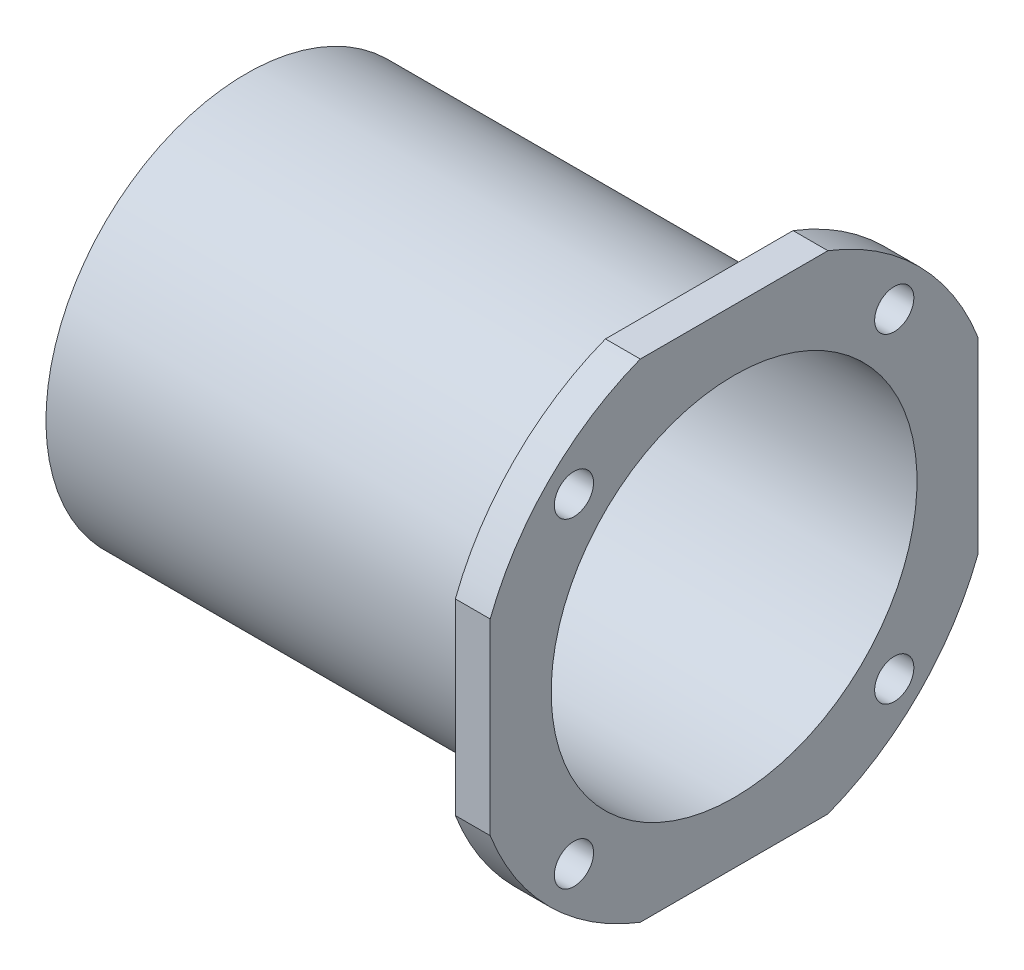
ISO-10303-21;
HEADER;
FILE_DESCRIPTION(('STEP AP214'),'2;1');
FILE_NAME('part.step','',(''),(''),'','','');
FILE_SCHEMA(('AUTOMOTIVE_DESIGN { 1 0 10303 214 1 1 1 1 }'));
ENDSEC;
DATA;
#1=APPLICATION_CONTEXT('core data for automotive mechanical design processes');
#2=APPLICATION_PROTOCOL_DEFINITION('international standard','automotive_design',2000,#1);
#3=PRODUCT_CONTEXT('',#1,'mechanical');
#4=PRODUCT('Part','Part','',(#3));
#5=PRODUCT_RELATED_PRODUCT_CATEGORY('part','',(#4));
#6=PRODUCT_DEFINITION_FORMATION('','',#4);
#7=PRODUCT_DEFINITION_CONTEXT('part definition',#1,'design');
#8=PRODUCT_DEFINITION('design','',#6,#7);
#9=PRODUCT_DEFINITION_SHAPE('','',#8);
#10=(LENGTH_UNIT() NAMED_UNIT(*) SI_UNIT(.MILLI.,.METRE.));
#11=(NAMED_UNIT(*) PLANE_ANGLE_UNIT() SI_UNIT($,.RADIAN.));
#12=(NAMED_UNIT(*) SI_UNIT($,.STERADIAN.) SOLID_ANGLE_UNIT());
#13=UNCERTAINTY_MEASURE_WITH_UNIT(LENGTH_MEASURE(1.E-05),#10,'distance_accuracy_value','');
#14=(GEOMETRIC_REPRESENTATION_CONTEXT(3) GLOBAL_UNCERTAINTY_ASSIGNED_CONTEXT((#13)) GLOBAL_UNIT_ASSIGNED_CONTEXT((#10,
#11,#12)) REPRESENTATION_CONTEXT('',''));
#15=CARTESIAN_POINT('',(0.,0.,0.));
#16=DIRECTION('',(0.,0.,1.));
#17=DIRECTION('',(1.,0.,0.));
#18=AXIS2_PLACEMENT_3D('',#15,#16,#17);
#19=CARTESIAN_POINT('',(56.,21.,0.));
#20=DIRECTION('',(-1.,0.,0.));
#21=DIRECTION('',(0.,-1.,0.));
#22=AXIS2_PLACEMENT_3D('',#19,#20,#21);
#23=PLANE('',#22);
#24=CARTESIAN_POINT('',(56.,-18.3847763108503,-18.3847763108507));
#25=DIRECTION('',(1.,0.,0.));
#26=DIRECTION('',(0.,0.,-1.));
#27=AXIS2_PLACEMENT_3D('',#24,#25,#26);
#28=CIRCLE('',#27,2.25);
#29=CARTESIAN_POINT('',(56.,-18.3847763108503,-20.6347763108507));
#30=VERTEX_POINT('',#29);
#31=EDGE_CURVE('E594',#30,#30,#28,.T.);
#32=ORIENTED_EDGE('',*,*,#31,.F.);
#33=EDGE_LOOP('',(#32));
#34=FACE_BOUND('',#33,.T.);
#35=CARTESIAN_POINT('',(56.,18.3847763108497,18.3847763108502));
#36=DIRECTION('',(1.,0.,0.));
#37=DIRECTION('',(0.,0.,-1.));
#38=AXIS2_PLACEMENT_3D('',#35,#36,#37);
#39=CIRCLE('',#38,2.25);
#40=CARTESIAN_POINT('',(56.,18.3847763108497,16.1347763108502));
#41=VERTEX_POINT('',#40);
#42=EDGE_CURVE('E608',#41,#41,#39,.T.);
#43=ORIENTED_EDGE('',*,*,#42,.F.);
#44=EDGE_LOOP('',(#43));
#45=FACE_BOUND('',#44,.T.);
#46=CARTESIAN_POINT('',(56.,0.,0.));
#47=DIRECTION('',(-1.,0.,0.));
#48=DIRECTION('',(0.,-1.,0.));
#49=AXIS2_PLACEMENT_3D('',#46,#47,#48);
#50=CIRCLE('',#49,21.);
#51=CARTESIAN_POINT('',(56.,-21.,0.));
#52=VERTEX_POINT('',#51);
#53=EDGE_CURVE('E178',#52,#52,#50,.T.);
#54=ORIENTED_EDGE('',*,*,#53,.T.);
#55=EDGE_LOOP('',(#54));
#56=FACE_BOUND('',#55,.T.);
#57=DIRECTION('',(0.,0.,1.));
#58=VECTOR('',#57,1.);
#59=CARTESIAN_POINT('',(56.,28.,28.));
#60=LINE('',#59,#58);
#61=CARTESIAN_POINT('',(56.,28.,-10.770329614269));
#62=VERTEX_POINT('',#61);
#63=CARTESIAN_POINT('',(56.,28.,10.770329614269));
#64=VERTEX_POINT('',#63);
#65=EDGE_CURVE('E616',#62,#64,#60,.T.);
#66=ORIENTED_EDGE('',*,*,#65,.T.);
#67=CARTESIAN_POINT('',(56.,0.,0.));
#68=DIRECTION('',(-1.,0.,0.));
#69=DIRECTION('',(0.,-1.,0.));
#70=AXIS2_PLACEMENT_3D('',#67,#68,#69);
#71=CIRCLE('',#70,30.);
#72=CARTESIAN_POINT('',(56.,10.770329614269,28.));
#73=VERTEX_POINT('',#72);
#74=EDGE_CURVE('E179',#73,#64,#71,.T.);
#75=ORIENTED_EDGE('',*,*,#74,.F.);
#76=DIRECTION('',(0.,-1.,0.));
#77=VECTOR('',#76,1.);
#78=CARTESIAN_POINT('',(56.,-28.,28.));
#79=LINE('',#78,#77);
#80=CARTESIAN_POINT('',(56.,-10.770329614269,28.));
#81=VERTEX_POINT('',#80);
#82=EDGE_CURVE('E619',#73,#81,#79,.T.);
#83=ORIENTED_EDGE('',*,*,#82,.T.);
#84=CARTESIAN_POINT('',(56.,-28.,10.770329614269));
#85=VERTEX_POINT('',#84);
#86=EDGE_CURVE('E175',#85,#81,#71,.T.);
#87=ORIENTED_EDGE('',*,*,#86,.F.);
#88=DIRECTION('',(0.,0.,-1.));
#89=VECTOR('',#88,1.);
#90=CARTESIAN_POINT('',(56.,-28.,28.));
#91=LINE('',#90,#89);
#92=CARTESIAN_POINT('',(56.,-28.,-10.770329614269));
#93=VERTEX_POINT('',#92);
#94=EDGE_CURVE('E161',#85,#93,#91,.T.);
#95=ORIENTED_EDGE('',*,*,#94,.T.);
#96=CARTESIAN_POINT('',(56.,-10.770329614269,-28.));
#97=VERTEX_POINT('',#96);
#98=EDGE_CURVE('E173',#97,#93,#71,.T.);
#99=ORIENTED_EDGE('',*,*,#98,.F.);
#100=DIRECTION('',(0.,1.,0.));
#101=VECTOR('',#100,1.);
#102=CARTESIAN_POINT('',(56.,-28.,-28.));
#103=LINE('',#102,#101);
#104=CARTESIAN_POINT('',(56.,10.770329614269,-28.));
#105=VERTEX_POINT('',#104);
#106=EDGE_CURVE('E614',#97,#105,#103,.T.);
#107=ORIENTED_EDGE('',*,*,#106,.T.);
#108=EDGE_CURVE('E160',#62,#105,#71,.T.);
#109=ORIENTED_EDGE('',*,*,#108,.F.);
#110=EDGE_LOOP('',(#66,#75,#83,#87,#95,#99,#107,#109));
#111=FACE_BOUND('',#110,.T.);
#112=CARTESIAN_POINT('',(56.,-18.3847763108507,18.3847763108497));
#113=DIRECTION('',(1.,0.,0.));
#114=DIRECTION('',(0.,0.,-1.));
#115=AXIS2_PLACEMENT_3D('',#112,#113,#114);
#116=CIRCLE('',#115,2.25);
#117=CARTESIAN_POINT('',(56.,-18.3847763108507,16.1347763108497));
#118=VERTEX_POINT('',#117);
#119=EDGE_CURVE('E602',#118,#118,#116,.T.);
#120=ORIENTED_EDGE('',*,*,#119,.F.);
#121=EDGE_LOOP('',(#120));
#122=FACE_BOUND('',#121,.T.);
#123=CARTESIAN_POINT('',(56.,18.3847763108502,-18.3847763108503));
#124=DIRECTION('',(1.,0.,0.));
#125=DIRECTION('',(0.,0.,-1.));
#126=AXIS2_PLACEMENT_3D('',#123,#124,#125);
#127=CIRCLE('',#126,2.25);
#128=CARTESIAN_POINT('',(56.,18.3847763108502,-20.6347763108503));
#129=VERTEX_POINT('',#128);
#130=EDGE_CURVE('E591',#129,#129,#127,.T.);
#131=ORIENTED_EDGE('',*,*,#130,.F.);
#132=EDGE_LOOP('',(#131));
#133=FACE_BOUND('',#132,.T.);
#134=ADVANCED_FACE('F33',(#34,#45,#56,#111,#122,#133),#23,.F.);
#135=CARTESIAN_POINT('',(0.,0.,0.));
#136=DIRECTION('',(-1.,0.,0.));
#137=DIRECTION('',(0.,-1.,0.));
#138=AXIS2_PLACEMENT_3D('',#135,#136,#137);
#139=CYLINDRICAL_SURFACE('',#138,30.);
#140=DIRECTION('',(-1.,0.,0.));
#141=VECTOR('',#140,1.);
#142=CARTESIAN_POINT('',(0.,28.,-10.770329614269));
#143=LINE('',#142,#141);
#144=CARTESIAN_POINT('',(52.,28.,-10.770329614269));
#145=VERTEX_POINT('',#144);
#146=EDGE_CURVE('E55',#62,#145,#143,.T.);
#147=ORIENTED_EDGE('',*,*,#146,.F.);
#148=ORIENTED_EDGE('',*,*,#108,.T.);
#149=DIRECTION('',(-1.,0.,0.));
#150=VECTOR('',#149,1.);
#151=CARTESIAN_POINT('',(0.,10.770329614269,-28.));
#152=LINE('',#151,#150);
#153=CARTESIAN_POINT('',(52.,10.770329614269,-28.));
#154=VERTEX_POINT('',#153);
#155=EDGE_CURVE('E145',#154,#105,#152,.F.);
#156=ORIENTED_EDGE('',*,*,#155,.F.);
#157=CARTESIAN_POINT('',(52.,0.,0.));
#158=DIRECTION('',(-1.,0.,0.));
#159=DIRECTION('',(0.,-1.,0.));
#160=AXIS2_PLACEMENT_3D('',#157,#158,#159);
#161=CIRCLE('',#160,30.);
#162=EDGE_CURVE('E158',#145,#154,#161,.T.);
#163=ORIENTED_EDGE('',*,*,#162,.F.);
#164=EDGE_LOOP('',(#147,#148,#156,#163));
#165=FACE_BOUND('',#164,.T.);
#166=ADVANCED_FACE('F157',(#165),#139,.T.);
#167=DIRECTION('',(-1.,0.,0.));
#168=VECTOR('',#167,1.);
#169=CARTESIAN_POINT('',(0.,28.,10.770329614269));
#170=LINE('',#169,#168);
#171=CARTESIAN_POINT('',(52.,28.,10.770329614269));
#172=VERTEX_POINT('',#171);
#173=EDGE_CURVE('E633',#172,#64,#170,.F.);
#174=ORIENTED_EDGE('',*,*,#173,.F.);
#175=CARTESIAN_POINT('',(52.,10.770329614269,28.));
#176=VERTEX_POINT('',#175);
#177=EDGE_CURVE('E165',#176,#172,#161,.T.);
#178=ORIENTED_EDGE('',*,*,#177,.F.);
#179=DIRECTION('',(-1.,0.,0.));
#180=VECTOR('',#179,1.);
#181=CARTESIAN_POINT('',(0.,10.770329614269,28.));
#182=LINE('',#181,#180);
#183=EDGE_CURVE('E631',#73,#176,#182,.T.);
#184=ORIENTED_EDGE('',*,*,#183,.F.);
#185=ORIENTED_EDGE('',*,*,#74,.T.);
#186=EDGE_LOOP('',(#174,#178,#184,#185));
#187=FACE_BOUND('',#186,.T.);
#188=ADVANCED_FACE('F228',(#187),#139,.T.);
#189=DIRECTION('',(-1.,0.,0.));
#190=VECTOR('',#189,1.);
#191=CARTESIAN_POINT('',(0.,-10.770329614269,28.));
#192=LINE('',#191,#190);
#193=CARTESIAN_POINT('',(52.,-10.770329614269,28.));
#194=VERTEX_POINT('',#193);
#195=EDGE_CURVE('E629',#194,#81,#192,.F.);
#196=ORIENTED_EDGE('',*,*,#195,.F.);
#197=CARTESIAN_POINT('',(52.,-28.,10.770329614269));
#198=VERTEX_POINT('',#197);
#199=EDGE_CURVE('E168',#198,#194,#161,.T.);
#200=ORIENTED_EDGE('',*,*,#199,.F.);
#201=DIRECTION('',(-1.,0.,0.));
#202=VECTOR('',#201,1.);
#203=CARTESIAN_POINT('',(0.,-28.,10.770329614269));
#204=LINE('',#203,#202);
#205=EDGE_CURVE('E627',#85,#198,#204,.T.);
#206=ORIENTED_EDGE('',*,*,#205,.F.);
#207=ORIENTED_EDGE('',*,*,#86,.T.);
#208=EDGE_LOOP('',(#196,#200,#206,#207));
#209=FACE_BOUND('',#208,.T.);
#210=ADVANCED_FACE('F479',(#209),#139,.T.);
#211=DIRECTION('',(-1.,0.,0.));
#212=VECTOR('',#211,1.);
#213=CARTESIAN_POINT('',(0.,-28.,-10.770329614269));
#214=LINE('',#213,#212);
#215=CARTESIAN_POINT('',(52.,-28.,-10.770329614269));
#216=VERTEX_POINT('',#215);
#217=EDGE_CURVE('E625',#216,#93,#214,.F.);
#218=ORIENTED_EDGE('',*,*,#217,.F.);
#219=CARTESIAN_POINT('',(52.,-10.770329614269,-28.));
#220=VERTEX_POINT('',#219);
#221=EDGE_CURVE('E166',#220,#216,#161,.T.);
#222=ORIENTED_EDGE('',*,*,#221,.F.);
#223=DIRECTION('',(-1.,0.,0.));
#224=VECTOR('',#223,1.);
#225=CARTESIAN_POINT('',(0.,-10.770329614269,-28.));
#226=LINE('',#225,#224);
#227=EDGE_CURVE('E48',#97,#220,#226,.T.);
#228=ORIENTED_EDGE('',*,*,#227,.F.);
#229=ORIENTED_EDGE('',*,*,#98,.T.);
#230=EDGE_LOOP('',(#218,#222,#228,#229));
#231=FACE_BOUND('',#230,.T.);
#232=ADVANCED_FACE('F224',(#231),#139,.T.);
#233=CARTESIAN_POINT('',(52.,23.,0.));
#234=DIRECTION('',(1.,0.,0.));
#235=DIRECTION('',(0.,1.,0.));
#236=AXIS2_PLACEMENT_3D('',#233,#234,#235);
#237=PLANE('',#236);
#238=CARTESIAN_POINT('',(52.,18.3847763108502,-18.3847763108503));
#239=DIRECTION('',(1.,0.,0.));
#240=DIRECTION('',(0.,1.,0.));
#241=AXIS2_PLACEMENT_3D('',#238,#239,#240);
#242=CIRCLE('',#241,2.25);
#243=CARTESIAN_POINT('',(52.,20.6347763108502,-18.3847763108503));
#244=VERTEX_POINT('',#243);
#245=EDGE_CURVE('E588',#244,#244,#242,.T.);
#246=ORIENTED_EDGE('',*,*,#245,.T.);
#247=EDGE_LOOP('',(#246));
#248=FACE_BOUND('',#247,.T.);
#249=CARTESIAN_POINT('',(52.,-18.3847763108503,-18.3847763108507));
#250=DIRECTION('',(1.,0.,0.));
#251=DIRECTION('',(0.,1.,0.));
#252=AXIS2_PLACEMENT_3D('',#249,#250,#251);
#253=CIRCLE('',#252,2.25);
#254=CARTESIAN_POINT('',(52.,-16.1347763108503,-18.3847763108507));
#255=VERTEX_POINT('',#254);
#256=EDGE_CURVE('E599',#255,#255,#253,.T.);
#257=ORIENTED_EDGE('',*,*,#256,.T.);
#258=EDGE_LOOP('',(#257));
#259=FACE_BOUND('',#258,.T.);
#260=CARTESIAN_POINT('',(52.,-18.3847763108507,18.3847763108497));
#261=DIRECTION('',(1.,0.,0.));
#262=DIRECTION('',(0.,1.,0.));
#263=AXIS2_PLACEMENT_3D('',#260,#261,#262);
#264=CIRCLE('',#263,2.25);
#265=CARTESIAN_POINT('',(52.,-16.1347763108507,18.3847763108497));
#266=VERTEX_POINT('',#265);
#267=EDGE_CURVE('E605',#266,#266,#264,.T.);
#268=ORIENTED_EDGE('',*,*,#267,.T.);
#269=EDGE_LOOP('',(#268));
#270=FACE_BOUND('',#269,.T.);
#271=CARTESIAN_POINT('',(52.,18.3847763108497,18.3847763108502));
#272=DIRECTION('',(1.,0.,0.));
#273=DIRECTION('',(0.,1.,0.));
#274=AXIS2_PLACEMENT_3D('',#271,#272,#273);
#275=CIRCLE('',#274,2.25);
#276=CARTESIAN_POINT('',(52.,20.6347763108497,18.3847763108502));
#277=VERTEX_POINT('',#276);
#278=EDGE_CURVE('E611',#277,#277,#275,.T.);
#279=ORIENTED_EDGE('',*,*,#278,.T.);
#280=EDGE_LOOP('',(#279));
#281=FACE_BOUND('',#280,.T.);
#282=CARTESIAN_POINT('',(52.,0.,0.));
#283=DIRECTION('',(-1.,0.,0.));
#284=DIRECTION('',(0.,-1.,0.));
#285=AXIS2_PLACEMENT_3D('',#282,#283,#284);
#286=CIRCLE('',#285,23.);
#287=CARTESIAN_POINT('',(52.,-23.,0.));
#288=VERTEX_POINT('',#287);
#289=EDGE_CURVE('E169',#288,#288,#286,.T.);
#290=ORIENTED_EDGE('',*,*,#289,.F.);
#291=EDGE_LOOP('',(#290));
#292=FACE_BOUND('',#291,.T.);
#293=DIRECTION('',(0.,0.,1.));
#294=VECTOR('',#293,1.);
#295=CARTESIAN_POINT('',(52.,28.,0.));
#296=LINE('',#295,#294);
#297=EDGE_CURVE('E12',#145,#172,#296,.T.);
#298=ORIENTED_EDGE('',*,*,#297,.F.);
#299=ORIENTED_EDGE('',*,*,#162,.T.);
#300=DIRECTION('',(0.,1.,0.));
#301=VECTOR('',#300,1.);
#302=CARTESIAN_POINT('',(52.,23.,-28.));
#303=LINE('',#302,#301);
#304=EDGE_CURVE('E142',#220,#154,#303,.T.);
#305=ORIENTED_EDGE('',*,*,#304,.F.);
#306=ORIENTED_EDGE('',*,*,#221,.T.);
#307=DIRECTION('',(0.,0.,-1.));
#308=VECTOR('',#307,1.);
#309=CARTESIAN_POINT('',(52.,-28.,0.));
#310=LINE('',#309,#308);
#311=EDGE_CURVE('E151',#198,#216,#310,.T.);
#312=ORIENTED_EDGE('',*,*,#311,.F.);
#313=ORIENTED_EDGE('',*,*,#199,.T.);
#314=DIRECTION('',(0.,-1.,0.));
#315=VECTOR('',#314,1.);
#316=CARTESIAN_POINT('',(52.,23.,28.));
#317=LINE('',#316,#315);
#318=EDGE_CURVE('E41',#176,#194,#317,.T.);
#319=ORIENTED_EDGE('',*,*,#318,.F.);
#320=ORIENTED_EDGE('',*,*,#177,.T.);
#321=EDGE_LOOP('',(#298,#299,#305,#306,#312,#313,#319,#320));
#322=FACE_BOUND('',#321,.T.);
#323=ADVANCED_FACE('F163',(#248,#259,#270,#281,#292,#322),#237,.F.);
#324=CARTESIAN_POINT('',(0.,0.,0.));
#325=DIRECTION('',(-1.,0.,0.));
#326=DIRECTION('',(0.,-1.,0.));
#327=AXIS2_PLACEMENT_3D('',#324,#325,#326);
#328=CYLINDRICAL_SURFACE('',#327,23.);
#329=CARTESIAN_POINT('',(0.,0.,0.));
#330=DIRECTION('',(-1.,0.,0.));
#331=DIRECTION('',(0.,-1.,0.));
#332=AXIS2_PLACEMENT_3D('',#329,#330,#331);
#333=CIRCLE('',#332,23.);
#334=CARTESIAN_POINT('',(0.,-23.,0.));
#335=VERTEX_POINT('',#334);
#336=EDGE_CURVE('E192',#335,#335,#333,.T.);
#337=ORIENTED_EDGE('',*,*,#336,.F.);
#338=EDGE_LOOP('',(#337));
#339=FACE_BOUND('',#338,.T.);
#340=ORIENTED_EDGE('',*,*,#289,.T.);
#341=EDGE_LOOP('',(#340));
#342=FACE_BOUND('',#341,.T.);
#343=ADVANCED_FACE('F35',(#339,#342),#328,.T.);
#344=CARTESIAN_POINT('',(0.,14.,0.));
#345=DIRECTION('',(1.,0.,0.));
#346=DIRECTION('',(0.,1.,0.));
#347=AXIS2_PLACEMENT_3D('',#344,#345,#346);
#348=PLANE('',#347);
#349=CARTESIAN_POINT('',(0.,0.,0.));
#350=DIRECTION('',(-1.,0.,0.));
#351=DIRECTION('',(0.,-1.,0.));
#352=AXIS2_PLACEMENT_3D('',#349,#350,#351);
#353=CIRCLE('',#352,14.);
#354=CARTESIAN_POINT('',(0.,2.22715383484865,13.8217142857143));
#355=VERTEX_POINT('',#354);
#356=CARTESIAN_POINT('',(0.,13.8217142857143,2.22715383484878));
#357=VERTEX_POINT('',#356);
#358=EDGE_CURVE('E188',#355,#357,#353,.T.);
#359=ORIENTED_EDGE('',*,*,#358,.F.);
#360=CARTESIAN_POINT('',(0.,2.46546825617527E-13,17.5000000000002));
#361=DIRECTION('',(-1.,0.,0.));
#362=DIRECTION('',(0.,0.,1.));
#363=AXIS2_PLACEMENT_3D('',#360,#361,#362);
#364=CIRCLE('',#363,4.3);
#365=CARTESIAN_POINT('',(0.,-2.22715383484826,13.8217142857144));
#366=VERTEX_POINT('',#365);
#367=EDGE_CURVE('E636',#366,#355,#364,.T.);
#368=ORIENTED_EDGE('',*,*,#367,.F.);
#369=CARTESIAN_POINT('',(0.,-13.8217142857142,2.22715383484917));
#370=VERTEX_POINT('',#369);
#371=EDGE_CURVE('E332',#370,#366,#353,.T.);
#372=ORIENTED_EDGE('',*,*,#371,.F.);
#373=CARTESIAN_POINT('',(0.,-17.5,4.93093651235054E-13));
#374=DIRECTION('',(-1.,0.,0.));
#375=DIRECTION('',(0.,0.,1.));
#376=AXIS2_PLACEMENT_3D('',#373,#374,#375);
#377=CIRCLE('',#376,4.3);
#378=CARTESIAN_POINT('',(0.,-13.8217142857144,-2.22715383484839));
#379=VERTEX_POINT('',#378);
#380=EDGE_CURVE('E325',#379,#370,#377,.T.);
#381=ORIENTED_EDGE('',*,*,#380,.F.);
#382=CARTESIAN_POINT('',(0.,-2.2271538348493,-13.8217142857142));
#383=VERTEX_POINT('',#382);
#384=EDGE_CURVE('E193',#383,#379,#353,.T.);
#385=ORIENTED_EDGE('',*,*,#384,.F.);
#386=CARTESIAN_POINT('',(0.,-2.44403693719019E-13,-17.4999999999998));
#387=DIRECTION('',(-1.,0.,0.));
#388=DIRECTION('',(0.,0.,1.));
#389=AXIS2_PLACEMENT_3D('',#386,#387,#388);
#390=CIRCLE('',#389,4.3);
#391=CARTESIAN_POINT('',(0.,2.22715383484891,-13.8217142857143));
#392=VERTEX_POINT('',#391);
#393=EDGE_CURVE('E343',#392,#383,#390,.T.);
#394=ORIENTED_EDGE('',*,*,#393,.F.);
#395=CARTESIAN_POINT('',(0.,13.8217142857143,-2.22715383484877));
#396=VERTEX_POINT('',#395);
#397=EDGE_CURVE('E189',#396,#392,#353,.T.);
#398=ORIENTED_EDGE('',*,*,#397,.F.);
#399=CARTESIAN_POINT('',(0.,17.5,0.));
#400=DIRECTION('',(-1.,0.,0.));
#401=DIRECTION('',(0.,0.,1.));
#402=AXIS2_PLACEMENT_3D('',#399,#400,#401);
#403=CIRCLE('',#402,4.3);
#404=EDGE_CURVE('E350',#357,#396,#403,.T.);
#405=ORIENTED_EDGE('',*,*,#404,.F.);
#406=EDGE_LOOP('',(#359,#368,#372,#381,#385,#394,#398,#405));
#407=FACE_BOUND('',#406,.T.);
#408=ORIENTED_EDGE('',*,*,#336,.T.);
#409=EDGE_LOOP('',(#408));
#410=FACE_BOUND('',#409,.T.);
#411=ADVANCED_FACE('F241',(#407,#410),#348,.F.);
#412=CARTESIAN_POINT('',(0.,0.,0.));
#413=DIRECTION('',(-1.,0.,0.));
#414=DIRECTION('',(0.,-1.,0.));
#415=AXIS2_PLACEMENT_3D('',#412,#413,#414);
#416=CYLINDRICAL_SURFACE('',#415,14.);
#417=CARTESIAN_POINT('',(5.,0.,0.));
#418=DIRECTION('',(-1.,0.,0.));
#419=DIRECTION('',(0.,-1.,0.));
#420=AXIS2_PLACEMENT_3D('',#417,#418,#419);
#421=CIRCLE('',#420,14.);
#422=CARTESIAN_POINT('',(5.,-14.,0.));
#423=VERTEX_POINT('',#422);
#424=EDGE_CURVE('E185',#423,#423,#421,.T.);
#425=ORIENTED_EDGE('',*,*,#424,.F.);
#426=EDGE_LOOP('',(#425));
#427=FACE_BOUND('',#426,.T.);
#428=CARTESIAN_POINT('',(0.499799999999979,-2.22745880103719,13.8216651417144));
#429=CARTESIAN_POINT('',(0.53452700887366,-2.17450267195264,13.8301988409129));
#430=CARTESIAN_POINT('',(0.568682868682122,-2.12113362184093,13.8384879815731));
#431=CARTESIAN_POINT('',(0.635686060217597,-2.01348576873813,13.8545602886711));
#432=CARTESIAN_POINT('',(0.66853303272463,-1.95920672172952,13.8623433165732));
#433=CARTESIAN_POINT('',(0.765113427459077,-1.79444409633226,13.8849668023181));
#434=CARTESIAN_POINT('',(0.826579881423483,-1.68249632642874,13.8990067709712));
#435=CARTESIAN_POINT('',(0.942752297210117,-1.45191250125192,13.9250024136205));
#436=CARTESIAN_POINT('',(0.997291302715078,-1.33318581836001,13.9369087329985));
#437=CARTESIAN_POINT('',(1.09533691874521,-1.09115905950565,13.957939394927));
#438=CARTESIAN_POINT('',(1.13886387644188,-0.967867908025646,13.967068874707));
#439=CARTESIAN_POINT('',(1.19851266990156,-0.762931476370153,13.9794236389379));
#440=CARTESIAN_POINT('',(1.2188338557511,-0.682561875823442,13.9835868705551));
#441=CARTESIAN_POINT('',(1.25307436531957,-0.520386819043669,13.9905603807477));
#442=CARTESIAN_POINT('',(1.26699346034359,-0.438581311625625,13.9933706109915));
#443=CARTESIAN_POINT('',(1.28770321184612,-0.274831076276759,13.9975394032496));
#444=CARTESIAN_POINT('',(1.29456155427785,-0.192895358087667,13.9989117514227));
#445=CARTESIAN_POINT('',(1.30105433815106,-0.0287273210950633,14.0002111524851));
#446=CARTESIAN_POINT('',(1.30068916852169,0.0535049815013604,14.000138283188));
#447=CARTESIAN_POINT('',(1.29275109237279,0.217607134094813,13.9985491542739));
#448=CARTESIAN_POINT('',(1.28517799968419,0.299476974675159,13.9970328573755));
#449=CARTESIAN_POINT('',(1.26319837700686,0.462237666722742,13.9926043465482));
#450=CARTESIAN_POINT('',(1.24879125662505,0.543128432988259,13.9896920120151));
#451=CARTESIAN_POINT('',(1.19589114820037,0.785113096770269,13.9789044903566));
#452=CARTESIAN_POINT('',(1.14780631961457,0.944071029493465,13.9689947124549));
#453=CARTESIAN_POINT('',(1.05270811004604,1.20015087805847,13.9488342648143));
#454=CARTESIAN_POINT('',(1.01114627245461,1.29953956583062,13.939902594349));
#455=CARTESIAN_POINT('',(0.921517045156459,1.49525723898225,13.9202680942927));
#456=CARTESIAN_POINT('',(0.873444873510951,1.5915839104395,13.9095639615021));
#457=CARTESIAN_POINT('',(0.773200023767398,1.77935250765614,13.8867809536507));
#458=CARTESIAN_POINT('',(0.721129599429609,1.8708537685084,13.8747341587205));
#459=CARTESIAN_POINT('',(0.613134639840423,2.05109927537818,13.8492317295261));
#460=CARTESIAN_POINT('',(0.557218288070547,2.13984882602937,13.8357790568541));
#461=CARTESIAN_POINT('',(0.4998,2.22745880103755,13.8216651417143));
#462=B_SPLINE_CURVE_WITH_KNOTS('',3,(#428,#429,#430,#431,#432,#433,#434,#435,#436,#437,#438,
#439,#440,#441,#442,#443,#444,#445,#446,#447,#448,#449,#450,#451,#452,#453,#454,#455,#456,#457,
#458,#459,#460,#461),.UNSPECIFIED.,.F.,.F.,(4,2,2,2,2,2,2,2,2,2,2,2,2,2,2,2,4),(0.,
0.191689711953611,0.38343167521143,0.768589902940532,1.16174888862297,1.55417603224027,
1.80295482789625,2.05174250971579,2.29812240118419,2.54448902707517,2.79086201639302,
3.03725629380239,3.53434488194304,3.85842911793776,4.18275270299694,4.50053525074866,
4.81766136649005),.UNSPECIFIED.);
#463=CARTESIAN_POINT('',(0.5,-2.22715383484826,13.8217142857144));
#464=VERTEX_POINT('',#463);
#465=CARTESIAN_POINT('',(0.499999999999999,2.22715383484865,13.8217142857143));
#466=VERTEX_POINT('',#465);
#467=EDGE_CURVE('E266',#464,#466,#462,.T.);
#468=ORIENTED_EDGE('',*,*,#467,.T.);
#469=DIRECTION('',(-1.,0.,0.));
#470=VECTOR('',#469,1.);
#471=CARTESIAN_POINT('',(0.249999999999999,2.22715383484865,13.8217142857143));
#472=LINE('',#471,#470);
#473=EDGE_CURVE('E152',#466,#355,#472,.T.);
#474=ORIENTED_EDGE('',*,*,#473,.T.);
#475=ORIENTED_EDGE('',*,*,#358,.T.);
#476=DIRECTION('',(-1.,0.,0.));
#477=VECTOR('',#476,1.);
#478=CARTESIAN_POINT('',(0.249999999999999,13.8217142857143,2.22715383484878));
#479=LINE('',#478,#477);
#480=CARTESIAN_POINT('',(0.5,13.8217142857143,2.22715383484878));
#481=VERTEX_POINT('',#480);
#482=EDGE_CURVE('E204',#357,#481,#479,.F.);
#483=ORIENTED_EDGE('',*,*,#482,.T.);
#484=CARTESIAN_POINT('',(0.4998,13.8216651417143,2.22745880103767));
#485=CARTESIAN_POINT('',(0.534527008873686,13.8301988409129,2.17450267195312));
#486=CARTESIAN_POINT('',(0.568682868682154,13.8384879815731,2.12113362184141));
#487=CARTESIAN_POINT('',(0.635686060217638,13.854560288671,2.01348576873861));
#488=CARTESIAN_POINT('',(0.668533032724677,13.8623433165731,1.95920672172999));
#489=CARTESIAN_POINT('',(0.765113427459139,13.884966802318,1.79444409633273));
#490=CARTESIAN_POINT('',(0.826579881423556,13.8990067709712,1.68249632642922));
#491=CARTESIAN_POINT('',(0.942752297210214,13.9250024136204,1.45191250125239));
#492=CARTESIAN_POINT('',(0.997291302715187,13.9369087329985,1.33318581836048));
#493=CARTESIAN_POINT('',(1.09533691874535,13.957939394927,1.09115905950611));
#494=CARTESIAN_POINT('',(1.13886387644203,13.967068874707,0.967867908026103));
#495=CARTESIAN_POINT('',(1.19851266990173,13.9794236389379,0.762931476370609));
#496=CARTESIAN_POINT('',(1.21883385575127,13.9835868705551,0.682561875823902));
#497=CARTESIAN_POINT('',(1.25307436531976,13.9905603807477,0.520386819044138));
#498=CARTESIAN_POINT('',(1.26699346034379,13.9933706109915,0.438581311626097));
#499=CARTESIAN_POINT('',(1.28770321184634,13.9975394032496,0.274831076277239));
#500=CARTESIAN_POINT('',(1.29456155427807,13.9989117514227,0.192895358088149));
#501=CARTESIAN_POINT('',(1.3010543381513,14.0002111524851,0.0287273210955515));
#502=CARTESIAN_POINT('',(1.30068916852194,14.000138283188,-0.0535049815008695));
#503=CARTESIAN_POINT('',(1.29275109237306,13.9985491542739,-0.217607134094318));
#504=CARTESIAN_POINT('',(1.28517799968447,13.9970328573755,-0.299476974674663));
#505=CARTESIAN_POINT('',(1.26319837700715,13.9926043465483,-0.462237666722245));
#506=CARTESIAN_POINT('',(1.24879125662535,13.9896920120151,-0.543128432987761));
#507=CARTESIAN_POINT('',(1.19589114820069,13.9789044903567,-0.78511309676977));
#508=CARTESIAN_POINT('',(1.1478063196149,13.9689947124549,-0.944071029492966));
#509=CARTESIAN_POINT('',(1.05270811004637,13.9488342648143,-1.20015087805804));
#510=CARTESIAN_POINT('',(1.01114627245492,13.9399025943491,-1.29953956583024));
#511=CARTESIAN_POINT('',(0.921517045156714,13.9202680942927,-1.495257238982));
#512=CARTESIAN_POINT('',(0.873444873511176,13.9095639615021,-1.5915839104393));
#513=CARTESIAN_POINT('',(0.773200023767559,13.8867809536507,-1.77935250765605));
#514=CARTESIAN_POINT('',(0.721129599429737,13.8747341587205,-1.87085376850837));
#515=CARTESIAN_POINT('',(0.61313463984048,13.8492317295261,-2.05109927537824));
#516=CARTESIAN_POINT('',(0.557218288070565,13.8357790568541,-2.13984882602948));
#517=CARTESIAN_POINT('',(0.499799999999978,13.8216651417143,-2.22745880103771));
#518=B_SPLINE_CURVE_WITH_KNOTS('',3,(#484,#485,#486,#487,#488,#489,#490,#491,#492,#493,#494,
#495,#496,#497,#498,#499,#500,#501,#502,#503,#504,#505,#506,#507,#508,#509,#510,#511,#512,#513,
#514,#515,#516,#517),.UNSPECIFIED.,.F.,.F.,(4,2,2,2,2,2,2,2,2,2,2,2,2,2,2,2,4),(0.,
0.191689711953621,0.383431675211451,0.768589902940572,1.16174888862303,1.55417603224036,
1.80295482789633,2.05174250971587,2.29812240118426,2.54448902707523,2.79086201639308,
3.03725629380244,3.53434488194308,3.858429117938,4.18275270299737,4.50053525074927,
4.81766136649085),.UNSPECIFIED.);
#519=CARTESIAN_POINT('',(0.499999999999998,13.8217142857143,-2.22715383484878));
#520=VERTEX_POINT('',#519);
#521=EDGE_CURVE('E196',#481,#520,#518,.T.);
#522=ORIENTED_EDGE('',*,*,#521,.T.);
#523=DIRECTION('',(-1.,0.,0.));
#524=VECTOR('',#523,1.);
#525=CARTESIAN_POINT('',(0.249999999999999,13.8217142857143,-2.22715383484878));
#526=LINE('',#525,#524);
#527=EDGE_CURVE('E359',#520,#396,#526,.T.);
#528=ORIENTED_EDGE('',*,*,#527,.T.);
#529=ORIENTED_EDGE('',*,*,#397,.T.);
#530=DIRECTION('',(-1.,0.,0.));
#531=VECTOR('',#530,1.);
#532=CARTESIAN_POINT('',(0.249999999999999,2.22715383484891,-13.8217142857143));
#533=LINE('',#532,#531);
#534=CARTESIAN_POINT('',(0.5,2.22715383484891,-13.8217142857143));
#535=VERTEX_POINT('',#534);
#536=EDGE_CURVE('E367',#392,#535,#533,.F.);
#537=ORIENTED_EDGE('',*,*,#536,.T.);
#538=CARTESIAN_POINT('',(0.4998,2.2274588010378,-13.8216651417143));
#539=CARTESIAN_POINT('',(0.534527008873691,2.17450267195325,-13.8301988409128));
#540=CARTESIAN_POINT('',(0.568682868682164,2.12113362184154,-13.838487981573));
#541=CARTESIAN_POINT('',(0.63568606021766,2.01348576873874,-13.854560288671));
#542=CARTESIAN_POINT('',(0.668533032724705,1.95920672173012,-13.8623433165731));
#543=CARTESIAN_POINT('',(0.765113427459184,1.79444409633286,-13.884966802318));
#544=CARTESIAN_POINT('',(0.826579881423613,1.68249632642934,-13.8990067709712));
#545=CARTESIAN_POINT('',(0.942752297210297,1.4519125012525,-13.9250024136204));
#546=CARTESIAN_POINT('',(0.997291302715285,1.33318581836059,-13.9369087329985));
#547=CARTESIAN_POINT('',(1.09533691874548,1.09115905950621,-13.957939394927));
#548=CARTESIAN_POINT('',(1.13886387644217,0.967867908026199,-13.9670688747069));
#549=CARTESIAN_POINT('',(1.1985126699019,0.762931476370705,-13.9794236389379));
#550=CARTESIAN_POINT('',(1.21883385575145,0.682561875824002,-13.9835868705551));
#551=CARTESIAN_POINT('',(1.25307436531995,0.520386819044247,-13.9905603807477));
#552=CARTESIAN_POINT('',(1.26699346034399,0.43858131162621,-13.9933706109914));
#553=CARTESIAN_POINT('',(1.28770321184655,0.27483107627736,-13.9975394032496));
#554=CARTESIAN_POINT('',(1.2945615542783,0.192895358088275,-13.9989117514227));
#555=CARTESIAN_POINT('',(1.30105433815155,0.0287273210956834,-14.0002111524851));
#556=CARTESIAN_POINT('',(1.3006891685222,-0.0535049815007348,-14.000138283188));
#557=CARTESIAN_POINT('',(1.29275109237333,-0.217607134094179,-13.9985491542739));
#558=CARTESIAN_POINT('',(1.28517799968475,-0.299476974674522,-13.9970328573755));
#559=CARTESIAN_POINT('',(1.26319837700746,-0.462237666722102,-13.9926043465483));
#560=CARTESIAN_POINT('',(1.24879125662566,-0.543128432987617,-13.9896920120151));
#561=CARTESIAN_POINT('',(1.19589114820103,-0.785113096769625,-13.9789044903567));
#562=CARTESIAN_POINT('',(1.14780631961525,-0.944071029492822,-13.9689947124549));
#563=CARTESIAN_POINT('',(1.05270811004672,-1.20015087805796,-13.9488342648143));
#564=CARTESIAN_POINT('',(1.01114627245524,-1.29953956583022,-13.9399025943491));
#565=CARTESIAN_POINT('',(0.921517045156989,-1.4952572389821,-13.9202680942927));
#566=CARTESIAN_POINT('',(0.873444873511422,-1.59158391043946,-13.9095639615021));
#567=CARTESIAN_POINT('',(0.773200023767742,-1.77935250765632,-13.8867809536507));
#568=CARTESIAN_POINT('',(0.721129599429886,-1.87085376850869,-13.8747341587205));
#569=CARTESIAN_POINT('',(0.613134639840556,-2.05109927537867,-13.8492317295261));
#570=CARTESIAN_POINT('',(0.557218288070603,-2.13984882602995,-13.835779056854));
#571=CARTESIAN_POINT('',(0.499799999999978,-2.22745880103822,-13.8216651417142));
#572=B_SPLINE_CURVE_WITH_KNOTS('',3,(#538,#539,#540,#541,#542,#543,#544,#545,#546,#547,#548,
#549,#550,#551,#552,#553,#554,#555,#556,#557,#558,#559,#560,#561,#562,#563,#564,#565,#566,#567,
#568,#569,#570,#571),.UNSPECIFIED.,.F.,.F.,(4,2,2,2,2,2,2,2,2,2,2,2,2,2,2,2,4),(0.,
0.191689711953633,0.383431675211474,0.768589902940619,1.16174888862311,1.55417603224047,
1.80295482789643,2.05174250971596,2.29812240118434,2.54448902707531,2.79086201639314,
3.0372562938025,3.53434488194313,3.85842911793824,4.1827527029978,4.5005352507499,
4.81766136649166),.UNSPECIFIED.);
#573=CARTESIAN_POINT('',(0.499999999999998,-2.22715383484929,-13.8217142857142));
#574=VERTEX_POINT('',#573);
#575=EDGE_CURVE('E360',#535,#574,#572,.T.);
#576=ORIENTED_EDGE('',*,*,#575,.T.);
#577=DIRECTION('',(-1.,0.,0.));
#578=VECTOR('',#577,1.);
#579=CARTESIAN_POINT('',(0.249999999999999,-2.2271538348493,-13.8217142857142));
#580=LINE('',#579,#578);
#581=EDGE_CURVE('E316',#574,#383,#580,.T.);
#582=ORIENTED_EDGE('',*,*,#581,.T.);
#583=ORIENTED_EDGE('',*,*,#384,.T.);
#584=DIRECTION('',(-1.,0.,0.));
#585=VECTOR('',#584,1.);
#586=CARTESIAN_POINT('',(0.249999999999999,-13.8217142857144,-2.22715383484839));
#587=LINE('',#586,#585);
#588=CARTESIAN_POINT('',(0.5,-13.8217142857144,-2.22715383484839));
#589=VERTEX_POINT('',#588);
#590=EDGE_CURVE('E277',#379,#589,#587,.F.);
#591=ORIENTED_EDGE('',*,*,#590,.T.);
#592=CARTESIAN_POINT('',(0.499799999999978,-13.8216651417143,-2.22745880103732));
#593=CARTESIAN_POINT('',(0.534527008873664,-13.8301988409129,-2.17450267195277));
#594=CARTESIAN_POINT('',(0.568682868682132,-13.8384879815731,-2.12113362184106));
#595=CARTESIAN_POINT('',(0.635686060217618,-13.8545602886711,-2.01348576873826));
#596=CARTESIAN_POINT('',(0.668533032724658,-13.8623433165731,-1.95920672172964));
#597=CARTESIAN_POINT('',(0.765113427459122,-13.8849668023181,-1.79444409633238));
#598=CARTESIAN_POINT('',(0.826579881423541,-13.8990067709712,-1.68249632642886));
#599=CARTESIAN_POINT('',(0.942752297210201,-13.9250024136205,-1.45191250125203));
#600=CARTESIAN_POINT('',(0.997291302715175,-13.9369087329985,-1.33318581836012));
#601=CARTESIAN_POINT('',(1.09533691874534,-13.957939394927,-1.09115905950574));
#602=CARTESIAN_POINT('',(1.13886387644202,-13.967068874707,-0.967867908025738));
#603=CARTESIAN_POINT('',(1.19851266990172,-13.9794236389379,-0.762931476370243));
#604=CARTESIAN_POINT('',(1.21883385575127,-13.9835868705551,-0.682561875823536));
#605=CARTESIAN_POINT('',(1.25307436531976,-13.9905603807477,-0.520386819043772));
#606=CARTESIAN_POINT('',(1.26699346034379,-13.9933706109915,-0.438581311625731));
#607=CARTESIAN_POINT('',(1.28770321184634,-13.9975394032496,-0.274831076276873));
#608=CARTESIAN_POINT('',(1.29456155427807,-13.9989117514227,-0.192895358087784));
#609=CARTESIAN_POINT('',(1.30105433815131,-14.0002111524851,-0.0287273210951867));
#610=CARTESIAN_POINT('',(1.30068916852194,-14.000138283188,0.0535049815012342));
#611=CARTESIAN_POINT('',(1.29275109237307,-13.9985491542739,0.217607134094683));
#612=CARTESIAN_POINT('',(1.28517799968447,-13.9970328573755,0.299476974675027));
#613=CARTESIAN_POINT('',(1.26319837700716,-13.9926043465482,0.462237666722609));
#614=CARTESIAN_POINT('',(1.24879125662536,-13.9896920120151,0.543128432988125));
#615=CARTESIAN_POINT('',(1.1958911482007,-13.9789044903566,0.785113096770135));
#616=CARTESIAN_POINT('',(1.14780631961491,-13.9689947124549,0.944071029493331));
#617=CARTESIAN_POINT('',(1.05270811004638,-13.9488342648143,1.2001508780584));
#618=CARTESIAN_POINT('',(1.01114627245493,-13.939902594349,1.29953956583061));
#619=CARTESIAN_POINT('',(0.92151704515673,-13.9202680942927,1.49525723898236));
#620=CARTESIAN_POINT('',(0.873444873511193,-13.9095639615021,1.59158391043966));
#621=CARTESIAN_POINT('',(0.773200023767577,-13.8867809536507,1.77935250765642));
#622=CARTESIAN_POINT('',(0.721129599429755,-13.8747341587205,1.87085376850873));
#623=CARTESIAN_POINT('',(0.613134639840498,-13.8492317295261,2.0510992753786));
#624=CARTESIAN_POINT('',(0.557218288070584,-13.8357790568541,2.13984882602984));
#625=CARTESIAN_POINT('',(0.499799999999999,-13.8216651417142,2.22745880103807));
#626=B_SPLINE_CURVE_WITH_KNOTS('',3,(#592,#593,#594,#595,#596,#597,#598,#599,#600,#601,#602,
#603,#604,#605,#606,#607,#608,#609,#610,#611,#612,#613,#614,#615,#616,#617,#618,#619,#620,#621,
#622,#623,#624,#625),.UNSPECIFIED.,.F.,.F.,(4,2,2,2,2,2,2,2,2,2,2,2,2,2,2,2,4),(0.,
0.191689711953623,0.383431675211454,0.768589902940579,1.16174888862304,1.55417603224038,
1.80295482789635,2.05174250971589,2.29812240118427,2.54448902707525,2.79086201639309,
3.03725629380246,3.5343448819431,3.85842911793801,4.18275270299738,4.50053525074928,
4.81766136649085),.UNSPECIFIED.);
#627=CARTESIAN_POINT('',(0.499999999999999,-13.8217142857142,2.22715383484917));
#628=VERTEX_POINT('',#627);
#629=EDGE_CURVE('E309',#589,#628,#626,.T.);
#630=ORIENTED_EDGE('',*,*,#629,.T.);
#631=DIRECTION('',(-1.,0.,0.));
#632=VECTOR('',#631,1.);
#633=CARTESIAN_POINT('',(0.249999999999999,-13.8217142857142,2.22715383484917));
#634=LINE('',#633,#632);
#635=EDGE_CURVE('E273',#628,#370,#634,.T.);
#636=ORIENTED_EDGE('',*,*,#635,.T.);
#637=ORIENTED_EDGE('',*,*,#371,.T.);
#638=DIRECTION('',(-1.,0.,0.));
#639=VECTOR('',#638,1.);
#640=CARTESIAN_POINT('',(0.249999999999999,-2.22715383484826,13.8217142857144));
#641=LINE('',#640,#639);
#642=EDGE_CURVE('E270',#366,#464,#641,.F.);
#643=ORIENTED_EDGE('',*,*,#642,.T.);
#644=EDGE_LOOP('',(#468,#474,#475,#483,#522,#528,#529,#537,#576,#582,#583,#591,#630,#636,#637,#643));
#645=FACE_BOUND('',#644,.T.);
#646=ADVANCED_FACE('F206',(#427,#645),#416,.F.);
#647=CARTESIAN_POINT('',(5.,14.,0.));
#648=DIRECTION('',(-1.,0.,0.));
#649=DIRECTION('',(0.,-1.,0.));
#650=AXIS2_PLACEMENT_3D('',#647,#648,#649);
#651=PLANE('',#650);
#652=CARTESIAN_POINT('',(5.,2.46546825617527E-13,17.5000000000002));
#653=DIRECTION('',(-1.,0.,0.));
#654=DIRECTION('',(0.,-1.,0.));
#655=AXIS2_PLACEMENT_3D('',#652,#653,#654);
#656=CIRCLE('',#655,2.25);
#657=CARTESIAN_POINT('',(5.,-2.24999999999975,17.5000000000002));
#658=VERTEX_POINT('',#657);
#659=EDGE_CURVE('E246',#658,#658,#656,.T.);
#660=ORIENTED_EDGE('',*,*,#659,.T.);
#661=EDGE_LOOP('',(#660));
#662=FACE_BOUND('',#661,.T.);
#663=CARTESIAN_POINT('',(5.,-17.5,4.93093651235054E-13));
#664=DIRECTION('',(-1.,0.,0.));
#665=DIRECTION('',(0.,-1.,0.));
#666=AXIS2_PLACEMENT_3D('',#663,#664,#665);
#667=CIRCLE('',#666,2.25);
#668=CARTESIAN_POINT('',(5.,-19.75,4.93093651235054E-13));
#669=VERTEX_POINT('',#668);
#670=EDGE_CURVE('E250',#669,#669,#667,.T.);
#671=ORIENTED_EDGE('',*,*,#670,.T.);
#672=EDGE_LOOP('',(#671));
#673=FACE_BOUND('',#672,.T.);
#674=CARTESIAN_POINT('',(5.,-2.44403693719019E-13,-17.4999999999998));
#675=DIRECTION('',(-1.,0.,0.));
#676=DIRECTION('',(0.,-1.,0.));
#677=AXIS2_PLACEMENT_3D('',#674,#675,#676);
#678=CIRCLE('',#677,2.25);
#679=CARTESIAN_POINT('',(5.,-2.25000000000024,-17.4999999999998));
#680=VERTEX_POINT('',#679);
#681=EDGE_CURVE('E254',#680,#680,#678,.T.);
#682=ORIENTED_EDGE('',*,*,#681,.T.);
#683=EDGE_LOOP('',(#682));
#684=FACE_BOUND('',#683,.T.);
#685=CARTESIAN_POINT('',(5.,17.5,0.));
#686=DIRECTION('',(-1.,0.,0.));
#687=DIRECTION('',(0.,-1.,0.));
#688=AXIS2_PLACEMENT_3D('',#685,#686,#687);
#689=CIRCLE('',#688,2.25);
#690=CARTESIAN_POINT('',(5.,15.25,0.));
#691=VERTEX_POINT('',#690);
#692=EDGE_CURVE('E258',#691,#691,#689,.T.);
#693=ORIENTED_EDGE('',*,*,#692,.T.);
#694=EDGE_LOOP('',(#693));
#695=FACE_BOUND('',#694,.T.);
#696=CARTESIAN_POINT('',(5.,0.,0.));
#697=DIRECTION('',(-1.,0.,0.));
#698=DIRECTION('',(0.,-1.,0.));
#699=AXIS2_PLACEMENT_3D('',#696,#697,#698);
#700=CIRCLE('',#699,21.);
#701=CARTESIAN_POINT('',(5.,-21.,0.));
#702=VERTEX_POINT('',#701);
#703=EDGE_CURVE('E182',#702,#702,#700,.T.);
#704=ORIENTED_EDGE('',*,*,#703,.F.);
#705=EDGE_LOOP('',(#704));
#706=FACE_BOUND('',#705,.T.);
#707=ORIENTED_EDGE('',*,*,#424,.T.);
#708=EDGE_LOOP('',(#707));
#709=FACE_BOUND('',#708,.T.);
#710=ADVANCED_FACE('F234',(#662,#673,#684,#695,#706,#709),#651,.F.);
#711=CARTESIAN_POINT('',(0.,0.,0.));
#712=DIRECTION('',(-1.,0.,0.));
#713=DIRECTION('',(0.,-1.,0.));
#714=AXIS2_PLACEMENT_3D('',#711,#712,#713);
#715=CYLINDRICAL_SURFACE('',#714,21.);
#716=ORIENTED_EDGE('',*,*,#53,.F.);
#717=EDGE_LOOP('',(#716));
#718=FACE_BOUND('',#717,.T.);
#719=ORIENTED_EDGE('',*,*,#703,.T.);
#720=EDGE_LOOP('',(#719));
#721=FACE_BOUND('',#720,.T.);
#722=ADVANCED_FACE('F232',(#718,#721),#715,.F.);
#723=CARTESIAN_POINT('',(0.,17.5,0.));
#724=DIRECTION('',(-1.,0.,0.));
#725=DIRECTION('',(0.,0.,1.));
#726=AXIS2_PLACEMENT_3D('',#723,#724,#725);
#727=CYLINDRICAL_SURFACE('',#726,4.3);
#728=CARTESIAN_POINT('',(0.5,17.5,0.));
#729=DIRECTION('',(-1.,0.,0.));
#730=DIRECTION('',(0.,0.,1.));
#731=AXIS2_PLACEMENT_3D('',#728,#729,#730);
#732=CIRCLE('',#731,4.3);
#733=EDGE_CURVE('E352',#481,#520,#732,.T.);
#734=ORIENTED_EDGE('',*,*,#733,.F.);
#735=ORIENTED_EDGE('',*,*,#482,.F.);
#736=ORIENTED_EDGE('',*,*,#404,.T.);
#737=ORIENTED_EDGE('',*,*,#527,.F.);
#738=EDGE_LOOP('',(#734,#735,#736,#737));
#739=FACE_BOUND('',#738,.T.);
#740=ADVANCED_FACE('F217',(#739),#727,.F.);
#741=CARTESIAN_POINT('',(0.,17.5,0.));
#742=DIRECTION('',(-1.,0.,0.));
#743=DIRECTION('',(0.,0.,1.));
#744=AXIS2_PLACEMENT_3D('',#741,#742,#743);
#745=CYLINDRICAL_SURFACE('',#744,2.25);
#746=CARTESIAN_POINT('',(2.55,17.5,0.));
#747=DIRECTION('',(-1.,0.,0.));
#748=DIRECTION('',(0.,0.,1.));
#749=AXIS2_PLACEMENT_3D('',#746,#747,#748);
#750=CIRCLE('',#749,2.25);
#751=CARTESIAN_POINT('',(2.55,17.5,2.25));
#752=VERTEX_POINT('',#751);
#753=EDGE_CURVE('E353',#752,#752,#750,.T.);
#754=ORIENTED_EDGE('',*,*,#753,.T.);
#755=EDGE_LOOP('',(#754));
#756=FACE_BOUND('',#755,.T.);
#757=ORIENTED_EDGE('',*,*,#692,.F.);
#758=EDGE_LOOP('',(#757));
#759=FACE_BOUND('',#758,.T.);
#760=ADVANCED_FACE('F215',(#756,#759),#745,.F.);
#761=CARTESIAN_POINT('',(0.5,17.5,0.));
#762=DIRECTION('',(-1.,0.,0.));
#763=DIRECTION('',(0.,0.,1.));
#764=AXIS2_PLACEMENT_3D('',#761,#762,#763);
#765=CONICAL_SURFACE('',#764,4.3,0.785398163397449);
#766=ORIENTED_EDGE('',*,*,#753,.F.);
#767=EDGE_LOOP('',(#766));
#768=FACE_BOUND('',#767,.T.);
#769=ORIENTED_EDGE('',*,*,#733,.T.);
#770=ORIENTED_EDGE('',*,*,#521,.F.);
#771=EDGE_LOOP('',(#769,#770));
#772=FACE_BOUND('',#771,.T.);
#773=ADVANCED_FACE('F209',(#768,#772),#765,.F.);
#774=CARTESIAN_POINT('',(0.,-2.44403693719019E-13,-17.4999999999998));
#775=DIRECTION('',(-1.,0.,0.));
#776=DIRECTION('',(0.,0.,1.));
#777=AXIS2_PLACEMENT_3D('',#774,#775,#776);
#778=CYLINDRICAL_SURFACE('',#777,4.3);
#779=CARTESIAN_POINT('',(0.5,-2.44403693719019E-13,-17.4999999999998));
#780=DIRECTION('',(-1.,0.,0.));
#781=DIRECTION('',(0.,0.,1.));
#782=AXIS2_PLACEMENT_3D('',#779,#780,#781);
#783=CIRCLE('',#782,4.3);
#784=EDGE_CURVE('E345',#535,#574,#783,.T.);
#785=ORIENTED_EDGE('',*,*,#784,.F.);
#786=ORIENTED_EDGE('',*,*,#536,.F.);
#787=ORIENTED_EDGE('',*,*,#393,.T.);
#788=ORIENTED_EDGE('',*,*,#581,.F.);
#789=EDGE_LOOP('',(#785,#786,#787,#788));
#790=FACE_BOUND('',#789,.T.);
#791=ADVANCED_FACE('F214',(#790),#778,.F.);
#792=CARTESIAN_POINT('',(0.,-2.44403693719019E-13,-17.4999999999998));
#793=DIRECTION('',(-1.,0.,0.));
#794=DIRECTION('',(0.,0.,1.));
#795=AXIS2_PLACEMENT_3D('',#792,#793,#794);
#796=CYLINDRICAL_SURFACE('',#795,2.25);
#797=CARTESIAN_POINT('',(2.55,-2.44403693719019E-13,-17.4999999999998));
#798=DIRECTION('',(-1.,0.,0.));
#799=DIRECTION('',(0.,0.,1.));
#800=AXIS2_PLACEMENT_3D('',#797,#798,#799);
#801=CIRCLE('',#800,2.25);
#802=CARTESIAN_POINT('',(2.55,-2.44403693719019E-13,-15.2499999999998));
#803=VERTEX_POINT('',#802);
#804=EDGE_CURVE('E347',#803,#803,#801,.T.);
#805=ORIENTED_EDGE('',*,*,#804,.T.);
#806=EDGE_LOOP('',(#805));
#807=FACE_BOUND('',#806,.T.);
#808=ORIENTED_EDGE('',*,*,#681,.F.);
#809=EDGE_LOOP('',(#808));
#810=FACE_BOUND('',#809,.T.);
#811=ADVANCED_FACE('F371',(#807,#810),#796,.F.);
#812=CARTESIAN_POINT('',(0.5,-2.44403693719019E-13,-17.4999999999998));
#813=DIRECTION('',(-1.,0.,0.));
#814=DIRECTION('',(0.,0.,1.));
#815=AXIS2_PLACEMENT_3D('',#812,#813,#814);
#816=CONICAL_SURFACE('',#815,4.3,0.785398163397448);
#817=ORIENTED_EDGE('',*,*,#804,.F.);
#818=EDGE_LOOP('',(#817));
#819=FACE_BOUND('',#818,.T.);
#820=ORIENTED_EDGE('',*,*,#784,.T.);
#821=ORIENTED_EDGE('',*,*,#575,.F.);
#822=EDGE_LOOP('',(#820,#821));
#823=FACE_BOUND('',#822,.T.);
#824=ADVANCED_FACE('F368',(#819,#823),#816,.F.);
#825=CARTESIAN_POINT('',(0.,-17.5,4.93093651235054E-13));
#826=DIRECTION('',(-1.,0.,0.));
#827=DIRECTION('',(0.,0.,1.));
#828=AXIS2_PLACEMENT_3D('',#825,#826,#827);
#829=CYLINDRICAL_SURFACE('',#828,2.25);
#830=CARTESIAN_POINT('',(2.55,-17.5,4.93093651235054E-13));
#831=DIRECTION('',(-1.,0.,0.));
#832=DIRECTION('',(0.,0.,1.));
#833=AXIS2_PLACEMENT_3D('',#830,#831,#832);
#834=CIRCLE('',#833,2.25);
#835=CARTESIAN_POINT('',(2.55,-17.5,2.2500000000005));
#836=VERTEX_POINT('',#835);
#837=EDGE_CURVE('E334',#836,#836,#834,.T.);
#838=ORIENTED_EDGE('',*,*,#837,.T.);
#839=EDGE_LOOP('',(#838));
#840=FACE_BOUND('',#839,.T.);
#841=ORIENTED_EDGE('',*,*,#670,.F.);
#842=EDGE_LOOP('',(#841));
#843=FACE_BOUND('',#842,.T.);
#844=ADVANCED_FACE('F301',(#840,#843),#829,.F.);
#845=CARTESIAN_POINT('',(0.,-17.5,4.93093651235054E-13));
#846=DIRECTION('',(-1.,0.,0.));
#847=DIRECTION('',(0.,0.,1.));
#848=AXIS2_PLACEMENT_3D('',#845,#846,#847);
#849=CYLINDRICAL_SURFACE('',#848,4.3);
#850=CARTESIAN_POINT('',(0.5,-17.5,4.93093651235054E-13));
#851=DIRECTION('',(-1.,0.,0.));
#852=DIRECTION('',(0.,0.,1.));
#853=AXIS2_PLACEMENT_3D('',#850,#851,#852);
#854=CIRCLE('',#853,4.3);
#855=EDGE_CURVE('E326',#589,#628,#854,.T.);
#856=ORIENTED_EDGE('',*,*,#855,.F.);
#857=ORIENTED_EDGE('',*,*,#590,.F.);
#858=ORIENTED_EDGE('',*,*,#380,.T.);
#859=ORIENTED_EDGE('',*,*,#635,.F.);
#860=EDGE_LOOP('',(#856,#857,#858,#859));
#861=FACE_BOUND('',#860,.T.);
#862=ADVANCED_FACE('F298',(#861),#849,.F.);
#863=CARTESIAN_POINT('',(0.5,-17.5,4.93093651235054E-13));
#864=DIRECTION('',(-1.,0.,0.));
#865=DIRECTION('',(0.,0.,1.));
#866=AXIS2_PLACEMENT_3D('',#863,#864,#865);
#867=CONICAL_SURFACE('',#866,4.3,0.785398163397448);
#868=ORIENTED_EDGE('',*,*,#837,.F.);
#869=EDGE_LOOP('',(#868));
#870=FACE_BOUND('',#869,.T.);
#871=ORIENTED_EDGE('',*,*,#855,.T.);
#872=ORIENTED_EDGE('',*,*,#629,.F.);
#873=EDGE_LOOP('',(#871,#872));
#874=FACE_BOUND('',#873,.T.);
#875=ADVANCED_FACE('F296',(#870,#874),#867,.F.);
#876=CARTESIAN_POINT('',(0.,2.46546825617527E-13,17.5000000000002));
#877=DIRECTION('',(-1.,0.,0.));
#878=DIRECTION('',(0.,0.,1.));
#879=AXIS2_PLACEMENT_3D('',#876,#877,#878);
#880=CYLINDRICAL_SURFACE('',#879,2.25);
#881=CARTESIAN_POINT('',(2.55,2.46546825617527E-13,17.5000000000002));
#882=DIRECTION('',(-1.,0.,0.));
#883=DIRECTION('',(0.,0.,1.));
#884=AXIS2_PLACEMENT_3D('',#881,#882,#883);
#885=CIRCLE('',#884,2.25);
#886=CARTESIAN_POINT('',(2.55,2.46546825617527E-13,19.7500000000002));
#887=VERTEX_POINT('',#886);
#888=EDGE_CURVE('E336',#887,#887,#885,.T.);
#889=ORIENTED_EDGE('',*,*,#888,.T.);
#890=EDGE_LOOP('',(#889));
#891=FACE_BOUND('',#890,.T.);
#892=ORIENTED_EDGE('',*,*,#659,.F.);
#893=EDGE_LOOP('',(#892));
#894=FACE_BOUND('',#893,.T.);
#895=ADVANCED_FACE('F293',(#891,#894),#880,.F.);
#896=CARTESIAN_POINT('',(0.,2.46546825617527E-13,17.5000000000002));
#897=DIRECTION('',(-1.,0.,0.));
#898=DIRECTION('',(0.,0.,1.));
#899=AXIS2_PLACEMENT_3D('',#896,#897,#898);
#900=CYLINDRICAL_SURFACE('',#899,4.3);
#901=CARTESIAN_POINT('',(0.5,2.46546825617527E-13,17.5000000000002));
#902=DIRECTION('',(-1.,0.,0.));
#903=DIRECTION('',(0.,0.,1.));
#904=AXIS2_PLACEMENT_3D('',#901,#902,#903);
#905=CIRCLE('',#904,4.3);
#906=EDGE_CURVE('E637',#464,#466,#905,.T.);
#907=ORIENTED_EDGE('',*,*,#906,.F.);
#908=ORIENTED_EDGE('',*,*,#642,.F.);
#909=ORIENTED_EDGE('',*,*,#367,.T.);
#910=ORIENTED_EDGE('',*,*,#473,.F.);
#911=EDGE_LOOP('',(#907,#908,#909,#910));
#912=FACE_BOUND('',#911,.T.);
#913=ADVANCED_FACE('F290',(#912),#900,.F.);
#914=CARTESIAN_POINT('',(0.5,2.46546825617527E-13,17.5000000000002));
#915=DIRECTION('',(-1.,0.,0.));
#916=DIRECTION('',(0.,0.,1.));
#917=AXIS2_PLACEMENT_3D('',#914,#915,#916);
#918=CONICAL_SURFACE('',#917,4.3,0.785398163397448);
#919=ORIENTED_EDGE('',*,*,#888,.F.);
#920=EDGE_LOOP('',(#919));
#921=FACE_BOUND('',#920,.T.);
#922=ORIENTED_EDGE('',*,*,#906,.T.);
#923=ORIENTED_EDGE('',*,*,#467,.F.);
#924=EDGE_LOOP('',(#922,#923));
#925=FACE_BOUND('',#924,.T.);
#926=ADVANCED_FACE('F285',(#921,#925),#918,.F.);
#927=CARTESIAN_POINT('',(-33.7013418798096,-28.,-28.));
#928=DIRECTION('',(0.,0.,-1.));
#929=DIRECTION('',(-1.,0.,0.));
#930=AXIS2_PLACEMENT_3D('',#927,#928,#929);
#931=PLANE('',#930);
#932=ORIENTED_EDGE('',*,*,#227,.T.);
#933=ORIENTED_EDGE('',*,*,#304,.T.);
#934=ORIENTED_EDGE('',*,*,#155,.T.);
#935=ORIENTED_EDGE('',*,*,#106,.F.);
#936=EDGE_LOOP('',(#932,#933,#934,#935));
#937=FACE_BOUND('',#936,.T.);
#938=ADVANCED_FACE('F144',(#937),#931,.T.);
#939=CARTESIAN_POINT('',(-33.7013418798096,-28.,28.));
#940=DIRECTION('',(0.,-1.,0.));
#941=DIRECTION('',(1.,0.,0.));
#942=AXIS2_PLACEMENT_3D('',#939,#940,#941);
#943=PLANE('',#942);
#944=ORIENTED_EDGE('',*,*,#205,.T.);
#945=ORIENTED_EDGE('',*,*,#311,.T.);
#946=ORIENTED_EDGE('',*,*,#217,.T.);
#947=ORIENTED_EDGE('',*,*,#94,.F.);
#948=EDGE_LOOP('',(#944,#945,#946,#947));
#949=FACE_BOUND('',#948,.T.);
#950=ADVANCED_FACE('F502',(#949),#943,.T.);
#951=CARTESIAN_POINT('',(-33.7013418798096,-28.,28.));
#952=DIRECTION('',(0.,0.,1.));
#953=DIRECTION('',(1.,0.,0.));
#954=AXIS2_PLACEMENT_3D('',#951,#952,#953);
#955=PLANE('',#954);
#956=ORIENTED_EDGE('',*,*,#183,.T.);
#957=ORIENTED_EDGE('',*,*,#318,.T.);
#958=ORIENTED_EDGE('',*,*,#195,.T.);
#959=ORIENTED_EDGE('',*,*,#82,.F.);
#960=EDGE_LOOP('',(#956,#957,#958,#959));
#961=FACE_BOUND('',#960,.T.);
#962=ADVANCED_FACE('F510',(#961),#955,.T.);
#963=CARTESIAN_POINT('',(-33.7013418798096,28.,28.));
#964=DIRECTION('',(0.,1.,0.));
#965=DIRECTION('',(-1.,0.,0.));
#966=AXIS2_PLACEMENT_3D('',#963,#964,#965);
#967=PLANE('',#966);
#968=ORIENTED_EDGE('',*,*,#146,.T.);
#969=ORIENTED_EDGE('',*,*,#297,.T.);
#970=ORIENTED_EDGE('',*,*,#173,.T.);
#971=ORIENTED_EDGE('',*,*,#65,.F.);
#972=EDGE_LOOP('',(#968,#969,#970,#971));
#973=FACE_BOUND('',#972,.T.);
#974=ADVANCED_FACE('F520',(#973),#967,.T.);
#975=CARTESIAN_POINT('',(56.,18.3847763108497,18.3847763108502));
#976=DIRECTION('',(1.,0.,0.));
#977=DIRECTION('',(0.,0.,-1.));
#978=AXIS2_PLACEMENT_3D('',#975,#976,#977);
#979=CYLINDRICAL_SURFACE('',#978,2.25);
#980=ORIENTED_EDGE('',*,*,#278,.F.);
#981=EDGE_LOOP('',(#980));
#982=FACE_BOUND('',#981,.T.);
#983=ORIENTED_EDGE('',*,*,#42,.T.);
#984=EDGE_LOOP('',(#983));
#985=FACE_BOUND('',#984,.T.);
#986=ADVANCED_FACE('F530',(#982,#985),#979,.F.);
#987=CARTESIAN_POINT('',(56.,-18.3847763108507,18.3847763108497));
#988=DIRECTION('',(1.,0.,0.));
#989=DIRECTION('',(0.,0.,-1.));
#990=AXIS2_PLACEMENT_3D('',#987,#988,#989);
#991=CYLINDRICAL_SURFACE('',#990,2.25);
#992=ORIENTED_EDGE('',*,*,#267,.F.);
#993=EDGE_LOOP('',(#992));
#994=FACE_BOUND('',#993,.T.);
#995=ORIENTED_EDGE('',*,*,#119,.T.);
#996=EDGE_LOOP('',(#995));
#997=FACE_BOUND('',#996,.T.);
#998=ADVANCED_FACE('F551',(#994,#997),#991,.F.);
#999=CARTESIAN_POINT('',(56.,-18.3847763108503,-18.3847763108507));
#1000=DIRECTION('',(1.,0.,0.));
#1001=DIRECTION('',(0.,0.,-1.));
#1002=AXIS2_PLACEMENT_3D('',#999,#1000,#1001);
#1003=CYLINDRICAL_SURFACE('',#1002,2.25);
#1004=ORIENTED_EDGE('',*,*,#256,.F.);
#1005=EDGE_LOOP('',(#1004));
#1006=FACE_BOUND('',#1005,.T.);
#1007=ORIENTED_EDGE('',*,*,#31,.T.);
#1008=EDGE_LOOP('',(#1007));
#1009=FACE_BOUND('',#1008,.T.);
#1010=ADVANCED_FACE('F561',(#1006,#1009),#1003,.F.);
#1011=CARTESIAN_POINT('',(56.,18.3847763108502,-18.3847763108503));
#1012=DIRECTION('',(1.,0.,0.));
#1013=DIRECTION('',(0.,0.,-1.));
#1014=AXIS2_PLACEMENT_3D('',#1011,#1012,#1013);
#1015=CYLINDRICAL_SURFACE('',#1014,2.25);
#1016=ORIENTED_EDGE('',*,*,#245,.F.);
#1017=EDGE_LOOP('',(#1016));
#1018=FACE_BOUND('',#1017,.T.);
#1019=ORIENTED_EDGE('',*,*,#130,.T.);
#1020=EDGE_LOOP('',(#1019));
#1021=FACE_BOUND('',#1020,.T.);
#1022=ADVANCED_FACE('F571',(#1018,#1021),#1015,.F.);
#1023=CLOSED_SHELL('',(#134,#166,#188,#210,#232,#323,#343,#411,#646,#710,#722,#740,#760,#773,
#791,#811,#824,#844,#862,#875,#895,#913,#926,#938,#950,#962,#974,#986,#998,#1010,#1022));
#1024=MANIFOLD_SOLID_BREP('B2',#1023);
#1025=ADVANCED_BREP_SHAPE_REPRESENTATION('',(#18,#1024),#14);
#1026=SHAPE_DEFINITION_REPRESENTATION(#9,#1025);
ENDSEC;
END-ISO-10303-21;
